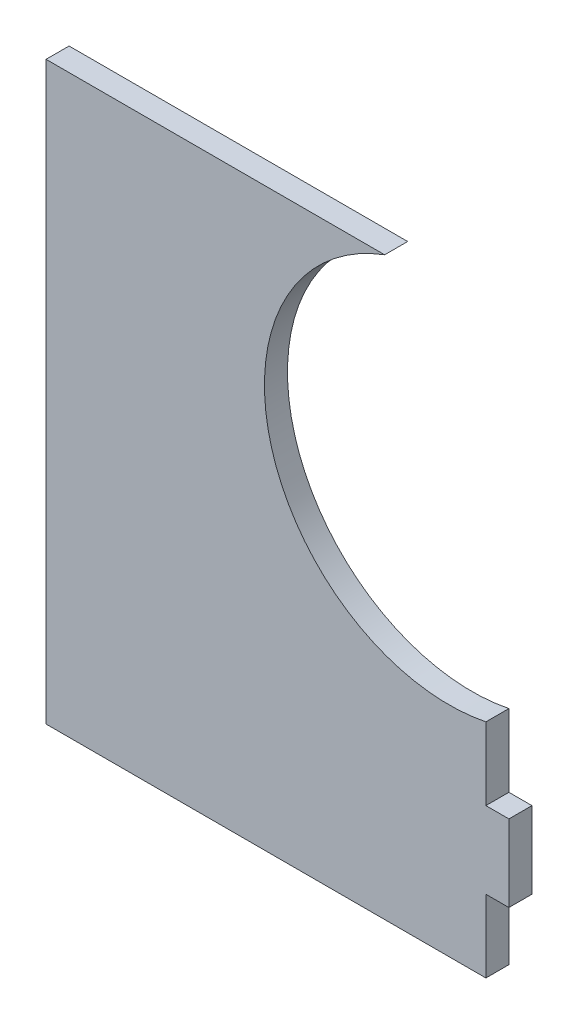
ISO-10303-21;
HEADER;
FILE_DESCRIPTION(('STEP AP214'),'2;1');
FILE_NAME('part.step','',(''),(''),'','','');
FILE_SCHEMA(('AUTOMOTIVE_DESIGN { 1 0 10303 214 1 1 1 1 }'));
ENDSEC;
DATA;
#1=APPLICATION_CONTEXT('core data for automotive mechanical design processes');
#2=APPLICATION_PROTOCOL_DEFINITION('international standard','automotive_design',2000,#1);
#3=PRODUCT_CONTEXT('',#1,'mechanical');
#4=PRODUCT('Part','Part','',(#3));
#5=PRODUCT_RELATED_PRODUCT_CATEGORY('part','',(#4));
#6=PRODUCT_DEFINITION_FORMATION('','',#4);
#7=PRODUCT_DEFINITION_CONTEXT('part definition',#1,'design');
#8=PRODUCT_DEFINITION('design','',#6,#7);
#9=PRODUCT_DEFINITION_SHAPE('','',#8);
#10=(LENGTH_UNIT() NAMED_UNIT(*) SI_UNIT(.MILLI.,.METRE.));
#11=(NAMED_UNIT(*) PLANE_ANGLE_UNIT() SI_UNIT($,.RADIAN.));
#12=(NAMED_UNIT(*) SI_UNIT($,.STERADIAN.) SOLID_ANGLE_UNIT());
#13=UNCERTAINTY_MEASURE_WITH_UNIT(LENGTH_MEASURE(1.E-05),#10,'distance_accuracy_value','');
#14=(GEOMETRIC_REPRESENTATION_CONTEXT(3) GLOBAL_UNCERTAINTY_ASSIGNED_CONTEXT((#13)) GLOBAL_UNIT_ASSIGNED_CONTEXT((#10,
#11,#12)) REPRESENTATION_CONTEXT('',''));
#15=CARTESIAN_POINT('',(0.,0.,0.));
#16=DIRECTION('',(0.,0.,1.));
#17=DIRECTION('',(1.,0.,0.));
#18=AXIS2_PLACEMENT_3D('',#15,#16,#17);
#19=CARTESIAN_POINT('',(-3.,10.2884069599617,3.));
#20=DIRECTION('',(-1.,0.,0.));
#21=DIRECTION('',(0.,0.,1.));
#22=AXIS2_PLACEMENT_3D('',#19,#20,#21);
#23=PLANE('',#22);
#24=DIRECTION('',(0.,1.,0.));
#25=VECTOR('',#24,1.);
#26=CARTESIAN_POINT('',(-3.,10.2884069599617,0.));
#27=LINE('',#26,#25);
#28=CARTESIAN_POINT('',(-3.,0.838406959961723,0.));
#29=VERTEX_POINT('',#28);
#30=CARTESIAN_POINT('',(-3.,10.2884069599617,0.));
#31=VERTEX_POINT('',#30);
#32=EDGE_CURVE('E135',#29,#31,#27,.T.);
#33=ORIENTED_EDGE('',*,*,#32,.T.);
#34=DIRECTION('',(0.,0.,-1.));
#35=VECTOR('',#34,1.);
#36=CARTESIAN_POINT('',(-3.,10.2884069599617,3.));
#37=LINE('',#36,#35);
#38=CARTESIAN_POINT('',(-3.,10.2884069599617,3.));
#39=VERTEX_POINT('',#38);
#40=EDGE_CURVE('E11',#39,#31,#37,.T.);
#41=ORIENTED_EDGE('',*,*,#40,.F.);
#42=DIRECTION('',(0.,1.,0.));
#43=VECTOR('',#42,1.);
#44=CARTESIAN_POINT('',(-3.,10.2884069599617,3.));
#45=LINE('',#44,#43);
#46=CARTESIAN_POINT('',(-3.,0.838406959961723,3.));
#47=VERTEX_POINT('',#46);
#48=EDGE_CURVE('E151',#47,#39,#45,.T.);
#49=ORIENTED_EDGE('',*,*,#48,.F.);
#50=DIRECTION('',(0.,0.,-1.));
#51=VECTOR('',#50,1.);
#52=CARTESIAN_POINT('',(-3.,0.838406959961723,3.));
#53=LINE('',#52,#51);
#54=EDGE_CURVE('E131',#47,#29,#53,.T.);
#55=ORIENTED_EDGE('',*,*,#54,.T.);
#56=EDGE_LOOP('',(#33,#41,#49,#55));
#57=FACE_BOUND('',#56,.T.);
#58=ADVANCED_FACE('F33',(#57),#23,.F.);
#59=CARTESIAN_POINT('',(-3.,10.2884069599617,3.));
#60=DIRECTION('',(0.,1.,0.));
#61=DIRECTION('',(0.,0.,1.));
#62=AXIS2_PLACEMENT_3D('',#59,#60,#61);
#63=PLANE('',#62);
#64=DIRECTION('',(1.,0.,0.));
#65=VECTOR('',#64,1.);
#66=CARTESIAN_POINT('',(-3.,10.2884069599617,0.));
#67=LINE('',#66,#65);
#68=CARTESIAN_POINT('',(0.,10.2884069599617,0.));
#69=VERTEX_POINT('',#68);
#70=EDGE_CURVE('E138',#31,#69,#67,.T.);
#71=ORIENTED_EDGE('',*,*,#70,.T.);
#72=DIRECTION('',(0.,0.,-1.));
#73=VECTOR('',#72,1.);
#74=CARTESIAN_POINT('',(0.,10.2884069599617,3.));
#75=LINE('',#74,#73);
#76=CARTESIAN_POINT('',(0.,10.2884069599617,3.));
#77=VERTEX_POINT('',#76);
#78=EDGE_CURVE('E41',#77,#69,#75,.T.);
#79=ORIENTED_EDGE('',*,*,#78,.F.);
#80=DIRECTION('',(1.,0.,0.));
#81=VECTOR('',#80,1.);
#82=CARTESIAN_POINT('',(-3.,10.2884069599617,3.));
#83=LINE('',#82,#81);
#84=EDGE_CURVE('E95',#39,#77,#83,.T.);
#85=ORIENTED_EDGE('',*,*,#84,.F.);
#86=ORIENTED_EDGE('',*,*,#40,.T.);
#87=EDGE_LOOP('',(#71,#79,#85,#86));
#88=FACE_BOUND('',#87,.T.);
#89=ADVANCED_FACE('F194',(#88),#63,.F.);
#90=CARTESIAN_POINT('',(0.,10.2884069599617,3.));
#91=DIRECTION('',(-1.,0.,0.));
#92=DIRECTION('',(0.,0.,1.));
#93=AXIS2_PLACEMENT_3D('',#90,#91,#92);
#94=PLANE('',#93);
#95=DIRECTION('',(0.,1.,0.));
#96=VECTOR('',#95,1.);
#97=CARTESIAN_POINT('',(0.,10.2884069599617,0.));
#98=LINE('',#97,#96);
#99=CARTESIAN_POINT('',(0.,20.2884069599617,0.));
#100=VERTEX_POINT('',#99);
#101=EDGE_CURVE('E140',#69,#100,#98,.T.);
#102=ORIENTED_EDGE('',*,*,#101,.T.);
#103=DIRECTION('',(0.,0.,-1.));
#104=VECTOR('',#103,1.);
#105=CARTESIAN_POINT('',(0.,20.2884069599617,3.));
#106=LINE('',#105,#104);
#107=CARTESIAN_POINT('',(0.,20.2884069599617,3.));
#108=VERTEX_POINT('',#107);
#109=EDGE_CURVE('E161',#108,#100,#106,.T.);
#110=ORIENTED_EDGE('',*,*,#109,.F.);
#111=DIRECTION('',(0.,1.,0.));
#112=VECTOR('',#111,1.);
#113=CARTESIAN_POINT('',(0.,10.2884069599617,3.));
#114=LINE('',#113,#112);
#115=EDGE_CURVE('E169',#77,#108,#114,.T.);
#116=ORIENTED_EDGE('',*,*,#115,.F.);
#117=ORIENTED_EDGE('',*,*,#78,.T.);
#118=EDGE_LOOP('',(#102,#110,#116,#117));
#119=FACE_BOUND('',#118,.T.);
#120=ADVANCED_FACE('F167',(#119),#94,.F.);
#121=CARTESIAN_POINT('',(0.,20.2884069599617,3.));
#122=DIRECTION('',(0.,-1.,0.));
#123=DIRECTION('',(0.,0.,-1.));
#124=AXIS2_PLACEMENT_3D('',#121,#122,#123);
#125=PLANE('',#124);
#126=DIRECTION('',(-1.,0.,0.));
#127=VECTOR('',#126,1.);
#128=CARTESIAN_POINT('',(0.,20.2884069599617,0.));
#129=LINE('',#128,#127);
#130=CARTESIAN_POINT('',(-3.,20.2884069599617,0.));
#131=VERTEX_POINT('',#130);
#132=EDGE_CURVE('E142',#100,#131,#129,.T.);
#133=ORIENTED_EDGE('',*,*,#132,.T.);
#134=DIRECTION('',(0.,0.,-1.));
#135=VECTOR('',#134,1.);
#136=CARTESIAN_POINT('',(-3.,20.2884069599617,3.));
#137=LINE('',#136,#135);
#138=CARTESIAN_POINT('',(-3.,20.2884069599617,3.));
#139=VERTEX_POINT('',#138);
#140=EDGE_CURVE('E158',#139,#131,#137,.T.);
#141=ORIENTED_EDGE('',*,*,#140,.F.);
#142=DIRECTION('',(-1.,0.,0.));
#143=VECTOR('',#142,1.);
#144=CARTESIAN_POINT('',(0.,20.2884069599617,3.));
#145=LINE('',#144,#143);
#146=EDGE_CURVE('E185',#108,#139,#145,.T.);
#147=ORIENTED_EDGE('',*,*,#146,.F.);
#148=ORIENTED_EDGE('',*,*,#109,.T.);
#149=EDGE_LOOP('',(#133,#141,#147,#148));
#150=FACE_BOUND('',#149,.T.);
#151=ADVANCED_FACE('F178',(#150),#125,.F.);
#152=CARTESIAN_POINT('',(-3.,20.2884069599617,3.));
#153=DIRECTION('',(-1.,0.,0.));
#154=DIRECTION('',(0.,0.,1.));
#155=AXIS2_PLACEMENT_3D('',#152,#153,#154);
#156=PLANE('',#155);
#157=DIRECTION('',(0.,1.,0.));
#158=VECTOR('',#157,1.);
#159=CARTESIAN_POINT('',(-3.,20.2884069599617,0.));
#160=LINE('',#159,#158);
#161=CARTESIAN_POINT('',(-2.99999999999999,29.7384069599617,0.));
#162=VERTEX_POINT('',#161);
#163=EDGE_CURVE('E144',#131,#162,#160,.T.);
#164=ORIENTED_EDGE('',*,*,#163,.T.);
#165=DIRECTION('',(0.,0.,-1.));
#166=VECTOR('',#165,1.);
#167=CARTESIAN_POINT('',(-2.99999999999999,29.7384069599617,3.));
#168=LINE('',#167,#166);
#169=CARTESIAN_POINT('',(-2.99999999999999,29.7384069599617,3.));
#170=VERTEX_POINT('',#169);
#171=EDGE_CURVE('E155',#170,#162,#168,.T.);
#172=ORIENTED_EDGE('',*,*,#171,.F.);
#173=DIRECTION('',(0.,1.,0.));
#174=VECTOR('',#173,1.);
#175=CARTESIAN_POINT('',(-3.,20.2884069599617,3.));
#176=LINE('',#175,#174);
#177=EDGE_CURVE('E184',#139,#170,#176,.T.);
#178=ORIENTED_EDGE('',*,*,#177,.F.);
#179=ORIENTED_EDGE('',*,*,#140,.T.);
#180=EDGE_LOOP('',(#164,#172,#178,#179));
#181=FACE_BOUND('',#180,.T.);
#182=ADVANCED_FACE('F182',(#181),#156,.F.);
#183=CARTESIAN_POINT('',(-7.79999999999999,53.3016069599617,3.));
#184=DIRECTION('',(0.,0.,-1.));
#185=DIRECTION('',(-1.,0.,0.));
#186=AXIS2_PLACEMENT_3D('',#183,#184,#185);
#187=CYLINDRICAL_SURFACE('',#186,24.0471286069668);
#188=CARTESIAN_POINT('',(-7.79999999999999,53.3016069599617,0.));
#189=DIRECTION('',(0.,0.,-1.));
#190=DIRECTION('',(-1.,0.,0.));
#191=AXIS2_PLACEMENT_3D('',#188,#189,#190);
#192=CIRCLE('',#191,24.0471286069668);
#193=CARTESIAN_POINT('',(-16.1879103476373,75.8384069599617,0.));
#194=VERTEX_POINT('',#193);
#195=EDGE_CURVE('E146',#162,#194,#192,.T.);
#196=ORIENTED_EDGE('',*,*,#195,.T.);
#197=DIRECTION('',(0.,0.,-1.));
#198=VECTOR('',#197,1.);
#199=CARTESIAN_POINT('',(-16.1879103476373,75.8384069599617,3.));
#200=LINE('',#199,#198);
#201=CARTESIAN_POINT('',(-16.1879103476373,75.8384069599617,3.));
#202=VERTEX_POINT('',#201);
#203=EDGE_CURVE('E126',#202,#194,#200,.T.);
#204=ORIENTED_EDGE('',*,*,#203,.F.);
#205=CARTESIAN_POINT('',(-7.79999999999999,53.3016069599617,3.));
#206=DIRECTION('',(0.,0.,-1.));
#207=DIRECTION('',(-1.,0.,0.));
#208=AXIS2_PLACEMENT_3D('',#205,#206,#207);
#209=CIRCLE('',#208,24.0471286069668);
#210=EDGE_CURVE('E117',#170,#202,#209,.T.);
#211=ORIENTED_EDGE('',*,*,#210,.F.);
#212=ORIENTED_EDGE('',*,*,#171,.T.);
#213=EDGE_LOOP('',(#196,#204,#211,#212));
#214=FACE_BOUND('',#213,.T.);
#215=ADVANCED_FACE('F206',(#214),#187,.F.);
#216=CARTESIAN_POINT('',(-60.3,75.8384069599617,3.));
#217=DIRECTION('',(0.,-1.,0.));
#218=DIRECTION('',(0.,0.,-1.));
#219=AXIS2_PLACEMENT_3D('',#216,#217,#218);
#220=PLANE('',#219);
#221=DIRECTION('',(-1.,0.,0.));
#222=VECTOR('',#221,1.);
#223=CARTESIAN_POINT('',(-60.3,75.8384069599617,0.));
#224=LINE('',#223,#222);
#225=CARTESIAN_POINT('',(-60.3,75.8384069599617,0.));
#226=VERTEX_POINT('',#225);
#227=EDGE_CURVE('E125',#194,#226,#224,.T.);
#228=ORIENTED_EDGE('',*,*,#227,.T.);
#229=DIRECTION('',(0.,0.,-1.));
#230=VECTOR('',#229,1.);
#231=CARTESIAN_POINT('',(-60.3,75.8384069599617,3.));
#232=LINE('',#231,#230);
#233=CARTESIAN_POINT('',(-60.3,75.8384069599617,3.));
#234=VERTEX_POINT('',#233);
#235=EDGE_CURVE('E122',#234,#226,#232,.T.);
#236=ORIENTED_EDGE('',*,*,#235,.F.);
#237=DIRECTION('',(-1.,0.,0.));
#238=VECTOR('',#237,1.);
#239=CARTESIAN_POINT('',(-60.3,75.8384069599617,3.));
#240=LINE('',#239,#238);
#241=EDGE_CURVE('E111',#202,#234,#240,.T.);
#242=ORIENTED_EDGE('',*,*,#241,.F.);
#243=ORIENTED_EDGE('',*,*,#203,.T.);
#244=EDGE_LOOP('',(#228,#236,#242,#243));
#245=FACE_BOUND('',#244,.T.);
#246=ADVANCED_FACE('F123',(#245),#220,.F.);
#247=CARTESIAN_POINT('',(-60.3,0.838406959961716,3.));
#248=DIRECTION('',(1.,0.,0.));
#249=DIRECTION('',(0.,0.,-1.));
#250=AXIS2_PLACEMENT_3D('',#247,#248,#249);
#251=PLANE('',#250);
#252=DIRECTION('',(0.,-1.,0.));
#253=VECTOR('',#252,1.);
#254=CARTESIAN_POINT('',(-60.3,0.838406959961716,0.));
#255=LINE('',#254,#253);
#256=CARTESIAN_POINT('',(-60.3,0.838406959961716,0.));
#257=VERTEX_POINT('',#256);
#258=EDGE_CURVE('E81',#226,#257,#255,.T.);
#259=ORIENTED_EDGE('',*,*,#258,.T.);
#260=DIRECTION('',(0.,0.,-1.));
#261=VECTOR('',#260,1.);
#262=CARTESIAN_POINT('',(-60.3,0.838406959961716,3.));
#263=LINE('',#262,#261);
#264=CARTESIAN_POINT('',(-60.3,0.838406959961716,3.));
#265=VERTEX_POINT('',#264);
#266=EDGE_CURVE('E127',#265,#257,#263,.T.);
#267=ORIENTED_EDGE('',*,*,#266,.F.);
#268=DIRECTION('',(0.,-1.,0.));
#269=VECTOR('',#268,1.);
#270=CARTESIAN_POINT('',(-60.3,0.838406959961716,3.));
#271=LINE('',#270,#269);
#272=EDGE_CURVE('E115',#234,#265,#271,.T.);
#273=ORIENTED_EDGE('',*,*,#272,.F.);
#274=ORIENTED_EDGE('',*,*,#235,.T.);
#275=EDGE_LOOP('',(#259,#267,#273,#274));
#276=FACE_BOUND('',#275,.T.);
#277=ADVANCED_FACE('F129',(#276),#251,.F.);
#278=CARTESIAN_POINT('',(-3.,0.838406959961723,3.));
#279=DIRECTION('',(0.,1.,0.));
#280=DIRECTION('',(-1.,0.,0.));
#281=AXIS2_PLACEMENT_3D('',#278,#279,#280);
#282=PLANE('',#281);
#283=DIRECTION('',(1.,0.,0.));
#284=VECTOR('',#283,1.);
#285=CARTESIAN_POINT('',(-3.,0.838406959961723,0.));
#286=LINE('',#285,#284);
#287=EDGE_CURVE('E87',#257,#29,#286,.T.);
#288=ORIENTED_EDGE('',*,*,#287,.T.);
#289=ORIENTED_EDGE('',*,*,#54,.F.);
#290=DIRECTION('',(1.,0.,0.));
#291=VECTOR('',#290,1.);
#292=CARTESIAN_POINT('',(-3.,0.838406959961723,3.));
#293=LINE('',#292,#291);
#294=EDGE_CURVE('E49',#265,#47,#293,.T.);
#295=ORIENTED_EDGE('',*,*,#294,.F.);
#296=ORIENTED_EDGE('',*,*,#266,.T.);
#297=EDGE_LOOP('',(#288,#289,#295,#296));
#298=FACE_BOUND('',#297,.T.);
#299=ADVANCED_FACE('F214',(#298),#282,.F.);
#300=CARTESIAN_POINT('',(-7.79999999999999,53.3016069599617,3.));
#301=DIRECTION('',(0.,0.,-1.));
#302=DIRECTION('',(-1.,0.,0.));
#303=AXIS2_PLACEMENT_3D('',#300,#301,#302);
#304=PLANE('',#303);
#305=ORIENTED_EDGE('',*,*,#48,.T.);
#306=ORIENTED_EDGE('',*,*,#84,.T.);
#307=ORIENTED_EDGE('',*,*,#115,.T.);
#308=ORIENTED_EDGE('',*,*,#146,.T.);
#309=ORIENTED_EDGE('',*,*,#177,.T.);
#310=ORIENTED_EDGE('',*,*,#210,.T.);
#311=ORIENTED_EDGE('',*,*,#241,.T.);
#312=ORIENTED_EDGE('',*,*,#272,.T.);
#313=ORIENTED_EDGE('',*,*,#294,.T.);
#314=EDGE_LOOP('',(#305,#306,#307,#308,#309,#310,#311,#312,#313));
#315=FACE_BOUND('',#314,.T.);
#316=ADVANCED_FACE('F113',(#315),#304,.F.);
#317=CARTESIAN_POINT('',(-7.79999999999999,53.3016069599617,0.));
#318=DIRECTION('',(0.,0.,-1.));
#319=DIRECTION('',(-1.,0.,0.));
#320=AXIS2_PLACEMENT_3D('',#317,#318,#319);
#321=PLANE('',#320);
#322=ORIENTED_EDGE('',*,*,#32,.F.);
#323=ORIENTED_EDGE('',*,*,#287,.F.);
#324=ORIENTED_EDGE('',*,*,#258,.F.);
#325=ORIENTED_EDGE('',*,*,#227,.F.);
#326=ORIENTED_EDGE('',*,*,#195,.F.);
#327=ORIENTED_EDGE('',*,*,#163,.F.);
#328=ORIENTED_EDGE('',*,*,#132,.F.);
#329=ORIENTED_EDGE('',*,*,#101,.F.);
#330=ORIENTED_EDGE('',*,*,#70,.F.);
#331=EDGE_LOOP('',(#322,#323,#324,#325,#326,#327,#328,#329,#330));
#332=FACE_BOUND('',#331,.T.);
#333=ADVANCED_FACE('F173',(#332),#321,.T.);
#334=CLOSED_SHELL('',(#58,#89,#120,#151,#182,#215,#246,#277,#299,#316,#333));
#335=MANIFOLD_SOLID_BREP('B2',#334);
#336=ADVANCED_BREP_SHAPE_REPRESENTATION('',(#18,#335),#14);
#337=SHAPE_DEFINITION_REPRESENTATION(#9,#336);
ENDSEC;
END-ISO-10303-21;
